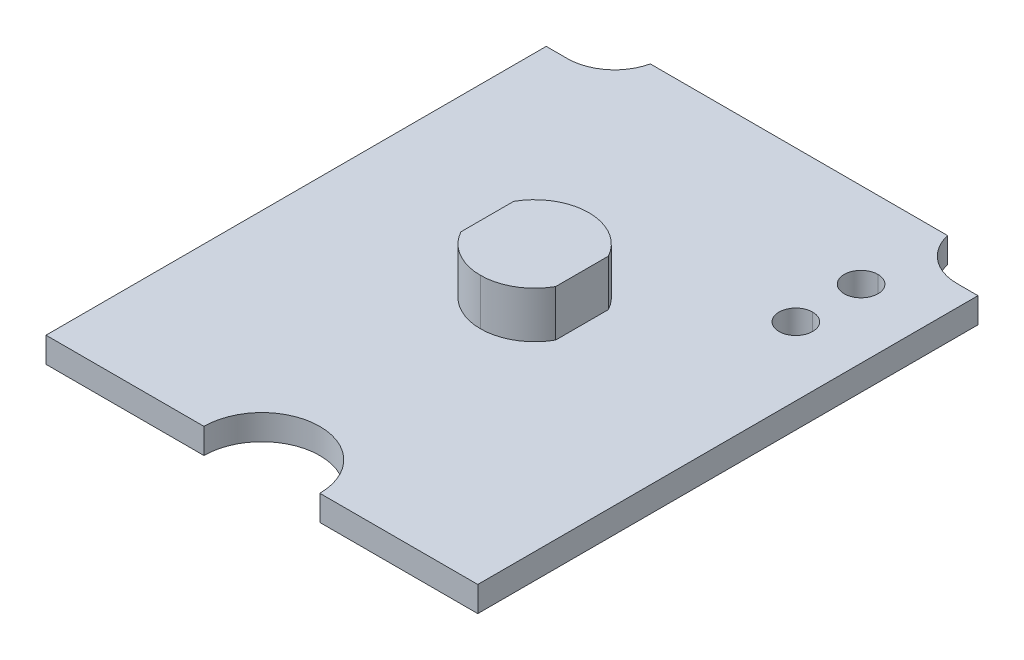
ISO-10303-21;
HEADER;
FILE_DESCRIPTION(('STEP AP214'),'2;1');
FILE_NAME('part.step','',(''),(''),'','','');
FILE_SCHEMA(('AUTOMOTIVE_DESIGN { 1 0 10303 214 1 1 1 1 }'));
ENDSEC;
DATA;
#1=APPLICATION_CONTEXT('core data for automotive mechanical design processes');
#2=APPLICATION_PROTOCOL_DEFINITION('international standard','automotive_design',2000,#1);
#3=PRODUCT_CONTEXT('',#1,'mechanical');
#4=PRODUCT('Part','Part','',(#3));
#5=PRODUCT_RELATED_PRODUCT_CATEGORY('part','',(#4));
#6=PRODUCT_DEFINITION_FORMATION('','',#4);
#7=PRODUCT_DEFINITION_CONTEXT('part definition',#1,'design');
#8=PRODUCT_DEFINITION('design','',#6,#7);
#9=PRODUCT_DEFINITION_SHAPE('','',#8);
#10=(LENGTH_UNIT() NAMED_UNIT(*) SI_UNIT(.MILLI.,.METRE.));
#11=(NAMED_UNIT(*) PLANE_ANGLE_UNIT() SI_UNIT($,.RADIAN.));
#12=(NAMED_UNIT(*) SI_UNIT($,.STERADIAN.) SOLID_ANGLE_UNIT());
#13=UNCERTAINTY_MEASURE_WITH_UNIT(LENGTH_MEASURE(1.E-05),#10,'distance_accuracy_value','');
#14=(GEOMETRIC_REPRESENTATION_CONTEXT(3) GLOBAL_UNCERTAINTY_ASSIGNED_CONTEXT((#13)) GLOBAL_UNIT_ASSIGNED_CONTEXT((#10,
#11,#12)) REPRESENTATION_CONTEXT('',''));
#15=CARTESIAN_POINT('',(0.,0.,0.));
#16=DIRECTION('',(0.,0.,1.));
#17=DIRECTION('',(1.,0.,0.));
#18=AXIS2_PLACEMENT_3D('',#15,#16,#17);
#19=CARTESIAN_POINT('',(0.,2.2,0.));
#20=DIRECTION('',(0.,1.,0.));
#21=DIRECTION('',(1.,0.,0.));
#22=AXIS2_PLACEMENT_3D('',#19,#20,#21);
#23=PLANE('',#22);
#24=DIRECTION('',(0.,0.,1.));
#25=VECTOR('',#24,1.);
#26=CARTESIAN_POINT('',(2.25,2.2,1.252247978637));
#27=LINE('',#26,#25);
#28=CARTESIAN_POINT('',(2.25,2.2,-1.25224797863691));
#29=VERTEX_POINT('',#28);
#30=CARTESIAN_POINT('',(2.25,2.2,1.25224797863691));
#31=VERTEX_POINT('',#30);
#32=EDGE_CURVE('E11',#29,#31,#27,.T.);
#33=ORIENTED_EDGE('',*,*,#32,.F.);
#34=CARTESIAN_POINT('',(0.,2.2,0.));
#35=DIRECTION('',(0.,-1.,0.));
#36=DIRECTION('',(0.,0.,1.));
#37=AXIS2_PLACEMENT_3D('',#34,#35,#36);
#38=CIRCLE('',#37,2.575);
#39=CARTESIAN_POINT('',(-2.25,2.2,-1.25224797863691));
#40=VERTEX_POINT('',#39);
#41=EDGE_CURVE('E422',#40,#29,#38,.T.);
#42=ORIENTED_EDGE('',*,*,#41,.F.);
#43=DIRECTION('',(0.,0.,-1.));
#44=VECTOR('',#43,1.);
#45=CARTESIAN_POINT('',(-2.25,2.2,-1.252247978637));
#46=LINE('',#45,#44);
#47=CARTESIAN_POINT('',(-2.24999999999996,2.2,1.25224797863689));
#48=VERTEX_POINT('',#47);
#49=EDGE_CURVE('E367',#48,#40,#46,.T.);
#50=ORIENTED_EDGE('',*,*,#49,.F.);
#51=CARTESIAN_POINT('',(0.,2.2,0.));
#52=DIRECTION('',(0.,-1.,0.));
#53=DIRECTION('',(0.,0.,1.));
#54=AXIS2_PLACEMENT_3D('',#51,#52,#53);
#55=CIRCLE('',#54,2.575);
#56=CARTESIAN_POINT('',(0.,2.2,2.575));
#57=VERTEX_POINT('',#56);
#58=EDGE_CURVE('E27',#57,#48,#55,.T.);
#59=ORIENTED_EDGE('',*,*,#58,.F.);
#60=CARTESIAN_POINT('',(0.,2.2,0.));
#61=DIRECTION('',(0.,-1.,0.));
#62=DIRECTION('',(0.,0.,1.));
#63=AXIS2_PLACEMENT_3D('',#60,#61,#62);
#64=CIRCLE('',#63,2.575);
#65=EDGE_CURVE('E273',#31,#57,#64,.T.);
#66=ORIENTED_EDGE('',*,*,#65,.F.);
#67=EDGE_LOOP('',(#33,#42,#50,#59,#66));
#68=FACE_BOUND('',#67,.T.);
#69=ADVANCED_FACE('F16',(#68),#23,.T.);
#70=CARTESIAN_POINT('',(2.25,0.,1.252247978637));
#71=DIRECTION('',(1.,0.,0.));
#72=DIRECTION('',(0.,1.,0.));
#73=AXIS2_PLACEMENT_3D('',#70,#71,#72);
#74=PLANE('',#73);
#75=DIRECTION('',(0.,-1.,0.));
#76=VECTOR('',#75,1.);
#77=CARTESIAN_POINT('',(2.25,0.,1.252247978637));
#78=LINE('',#77,#76);
#79=CARTESIAN_POINT('',(2.25,0.,1.25224797863691));
#80=VERTEX_POINT('',#79);
#81=EDGE_CURVE('E269',#31,#80,#78,.T.);
#82=ORIENTED_EDGE('',*,*,#81,.T.);
#83=DIRECTION('',(0.,0.,-1.));
#84=VECTOR('',#83,1.);
#85=CARTESIAN_POINT('',(2.25,0.,0.));
#86=LINE('',#85,#84);
#87=CARTESIAN_POINT('',(2.25,0.,-1.25224797863691));
#88=VERTEX_POINT('',#87);
#89=EDGE_CURVE('E476',#80,#88,#86,.T.);
#90=ORIENTED_EDGE('',*,*,#89,.T.);
#91=DIRECTION('',(0.,1.,0.));
#92=VECTOR('',#91,1.);
#93=CARTESIAN_POINT('',(2.25,0.,-1.252247978637));
#94=LINE('',#93,#92);
#95=EDGE_CURVE('E271',#88,#29,#94,.T.);
#96=ORIENTED_EDGE('',*,*,#95,.T.);
#97=ORIENTED_EDGE('',*,*,#32,.T.);
#98=EDGE_LOOP('',(#82,#90,#96,#97));
#99=FACE_BOUND('',#98,.T.);
#100=ADVANCED_FACE('F266',(#99),#74,.T.);
#101=CARTESIAN_POINT('',(0.,0.,0.));
#102=DIRECTION('',(0.,1.,0.));
#103=DIRECTION('',(0.,0.,1.));
#104=AXIS2_PLACEMENT_3D('',#101,#102,#103);
#105=CYLINDRICAL_SURFACE('',#104,2.575);
#106=CARTESIAN_POINT('',(0.,0.,0.));
#107=DIRECTION('',(0.,1.,0.));
#108=DIRECTION('',(0.,0.,1.));
#109=AXIS2_PLACEMENT_3D('',#106,#107,#108);
#110=CIRCLE('',#109,2.575);
#111=CARTESIAN_POINT('',(-2.24999999999996,0.,1.25224797863689));
#112=VERTEX_POINT('',#111);
#113=CARTESIAN_POINT('',(0.,0.,2.575));
#114=VERTEX_POINT('',#113);
#115=EDGE_CURVE('E314',#112,#114,#110,.T.);
#116=ORIENTED_EDGE('',*,*,#115,.T.);
#117=DIRECTION('',(0.,1.,0.));
#118=VECTOR('',#117,1.);
#119=CARTESIAN_POINT('',(0.,0.,2.575));
#120=LINE('',#119,#118);
#121=EDGE_CURVE('E286',#114,#57,#120,.T.);
#122=ORIENTED_EDGE('',*,*,#121,.T.);
#123=ORIENTED_EDGE('',*,*,#58,.T.);
#124=DIRECTION('',(0.,-1.,0.));
#125=VECTOR('',#124,1.);
#126=CARTESIAN_POINT('',(-2.24999999999992,0.,1.25224797863696));
#127=LINE('',#126,#125);
#128=EDGE_CURVE('E364',#48,#112,#127,.T.);
#129=ORIENTED_EDGE('',*,*,#128,.T.);
#130=EDGE_LOOP('',(#116,#122,#123,#129));
#131=FACE_BOUND('',#130,.T.);
#132=ADVANCED_FACE('F1019',(#131),#105,.T.);
#133=CARTESIAN_POINT('',(0.,0.,0.));
#134=DIRECTION('',(0.,1.,0.));
#135=DIRECTION('',(0.,0.,1.));
#136=AXIS2_PLACEMENT_3D('',#133,#134,#135);
#137=CYLINDRICAL_SURFACE('',#136,2.575);
#138=ORIENTED_EDGE('',*,*,#95,.F.);
#139=CARTESIAN_POINT('',(0.,0.,0.));
#140=DIRECTION('',(0.,1.,0.));
#141=DIRECTION('',(0.,0.,1.));
#142=AXIS2_PLACEMENT_3D('',#139,#140,#141);
#143=CIRCLE('',#142,2.575);
#144=CARTESIAN_POINT('',(-2.25,0.,-1.25224797863691));
#145=VERTEX_POINT('',#144);
#146=EDGE_CURVE('E313',#88,#145,#143,.T.);
#147=ORIENTED_EDGE('',*,*,#146,.T.);
#148=DIRECTION('',(0.,-1.,0.));
#149=VECTOR('',#148,1.);
#150=CARTESIAN_POINT('',(-2.25,0.,-1.252247978637));
#151=LINE('',#150,#149);
#152=EDGE_CURVE('E279',#40,#145,#151,.T.);
#153=ORIENTED_EDGE('',*,*,#152,.F.);
#154=ORIENTED_EDGE('',*,*,#41,.T.);
#155=EDGE_LOOP('',(#138,#147,#153,#154));
#156=FACE_BOUND('',#155,.T.);
#157=ADVANCED_FACE('F1014',(#156),#137,.T.);
#158=CARTESIAN_POINT('',(-2.25,0.,-1.252247978637));
#159=DIRECTION('',(-1.,0.,0.));
#160=DIRECTION('',(0.,0.,1.));
#161=AXIS2_PLACEMENT_3D('',#158,#159,#160);
#162=PLANE('',#161);
#163=ORIENTED_EDGE('',*,*,#152,.T.);
#164=DIRECTION('',(0.,0.,1.));
#165=VECTOR('',#164,1.);
#166=CARTESIAN_POINT('',(-2.25,0.,0.));
#167=LINE('',#166,#165);
#168=EDGE_CURVE('E309',#145,#112,#167,.T.);
#169=ORIENTED_EDGE('',*,*,#168,.T.);
#170=ORIENTED_EDGE('',*,*,#128,.F.);
#171=ORIENTED_EDGE('',*,*,#49,.T.);
#172=EDGE_LOOP('',(#163,#169,#170,#171));
#173=FACE_BOUND('',#172,.T.);
#174=ADVANCED_FACE('F1018',(#173),#162,.T.);
#175=CARTESIAN_POINT('',(0.,0.,0.));
#176=DIRECTION('',(0.,1.,0.));
#177=DIRECTION('',(0.,0.,1.));
#178=AXIS2_PLACEMENT_3D('',#175,#176,#177);
#179=CYLINDRICAL_SURFACE('',#178,2.575);
#180=ORIENTED_EDGE('',*,*,#121,.F.);
#181=CARTESIAN_POINT('',(0.,0.,0.));
#182=DIRECTION('',(0.,1.,0.));
#183=DIRECTION('',(0.,0.,1.));
#184=AXIS2_PLACEMENT_3D('',#181,#182,#183);
#185=CIRCLE('',#184,2.575);
#186=EDGE_CURVE('E283',#114,#80,#185,.T.);
#187=ORIENTED_EDGE('',*,*,#186,.T.);
#188=ORIENTED_EDGE('',*,*,#81,.F.);
#189=ORIENTED_EDGE('',*,*,#65,.T.);
#190=EDGE_LOOP('',(#180,#187,#188,#189));
#191=FACE_BOUND('',#190,.T.);
#192=ADVANCED_FACE('F281',(#191),#179,.T.);
#193=CARTESIAN_POINT('',(0.,0.,0.));
#194=DIRECTION('',(0.,1.,0.));
#195=DIRECTION('',(1.,0.,0.));
#196=AXIS2_PLACEMENT_3D('',#193,#194,#195);
#197=PLANE('',#196);
#198=CARTESIAN_POINT('',(0.,0.,-1.75));
#199=DIRECTION('',(0.,-1.,0.));
#200=DIRECTION('',(0.,0.,1.));
#201=AXIS2_PLACEMENT_3D('',#198,#199,#200);
#202=CIRCLE('',#201,0.25);
#203=CARTESIAN_POINT('',(0.,0.,-1.5));
#204=VERTEX_POINT('',#203);
#205=CARTESIAN_POINT('',(0.,0.,-2.));
#206=VERTEX_POINT('',#205);
#207=EDGE_CURVE('E374',#204,#206,#202,.T.);
#208=ORIENTED_EDGE('',*,*,#207,.F.);
#209=CARTESIAN_POINT('',(0.,0.,-1.75));
#210=DIRECTION('',(0.,-1.,0.));
#211=DIRECTION('',(0.,0.,1.));
#212=AXIS2_PLACEMENT_3D('',#209,#210,#211);
#213=CIRCLE('',#212,0.25);
#214=EDGE_CURVE('E308',#206,#204,#213,.T.);
#215=ORIENTED_EDGE('',*,*,#214,.F.);
#216=EDGE_LOOP('',(#208,#215));
#217=FACE_BOUND('',#216,.T.);
#218=CARTESIAN_POINT('',(0.,0.,1.75));
#219=DIRECTION('',(0.,-1.,0.));
#220=DIRECTION('',(0.,0.,1.));
#221=AXIS2_PLACEMENT_3D('',#218,#219,#220);
#222=CIRCLE('',#221,0.25);
#223=CARTESIAN_POINT('',(0.,0.,2.));
#224=VERTEX_POINT('',#223);
#225=CARTESIAN_POINT('',(0.,0.,1.5));
#226=VERTEX_POINT('',#225);
#227=EDGE_CURVE('E377',#224,#226,#222,.T.);
#228=ORIENTED_EDGE('',*,*,#227,.F.);
#229=CARTESIAN_POINT('',(0.,0.,1.75));
#230=DIRECTION('',(0.,-1.,0.));
#231=DIRECTION('',(0.,0.,1.));
#232=AXIS2_PLACEMENT_3D('',#229,#230,#231);
#233=CIRCLE('',#232,0.25);
#234=EDGE_CURVE('E472',#226,#224,#233,.T.);
#235=ORIENTED_EDGE('',*,*,#234,.F.);
#236=EDGE_LOOP('',(#228,#235));
#237=FACE_BOUND('',#236,.T.);
#238=ORIENTED_EDGE('',*,*,#115,.F.);
#239=ORIENTED_EDGE('',*,*,#168,.F.);
#240=ORIENTED_EDGE('',*,*,#146,.F.);
#241=ORIENTED_EDGE('',*,*,#89,.F.);
#242=ORIENTED_EDGE('',*,*,#186,.F.);
#243=EDGE_LOOP('',(#238,#239,#240,#241,#242));
#244=FACE_BOUND('',#243,.T.);
#245=ADVANCED_FACE('F1195',(#217,#237,#244),#197,.F.);
#246=CARTESIAN_POINT('',(0.,-4.5,0.));
#247=DIRECTION('',(0.,1.,0.));
#248=DIRECTION('',(1.,0.,0.));
#249=AXIS2_PLACEMENT_3D('',#246,#247,#248);
#250=PLANE('',#249);
#251=CARTESIAN_POINT('',(0.,-4.5,-1.75));
#252=DIRECTION('',(0.,1.,0.));
#253=DIRECTION('',(0.,0.,1.));
#254=AXIS2_PLACEMENT_3D('',#251,#252,#253);
#255=CIRCLE('',#254,0.25);
#256=CARTESIAN_POINT('',(0.,-4.5,-1.5));
#257=VERTEX_POINT('',#256);
#258=CARTESIAN_POINT('',(0.,-4.5,-2.));
#259=VERTEX_POINT('',#258);
#260=EDGE_CURVE('E20',#257,#259,#255,.T.);
#261=ORIENTED_EDGE('',*,*,#260,.F.);
#262=CARTESIAN_POINT('',(0.,-4.5,-1.75));
#263=DIRECTION('',(0.,1.,0.));
#264=DIRECTION('',(0.,0.,1.));
#265=AXIS2_PLACEMENT_3D('',#262,#263,#264);
#266=CIRCLE('',#265,0.25);
#267=EDGE_CURVE('E412',#259,#257,#266,.T.);
#268=ORIENTED_EDGE('',*,*,#267,.F.);
#269=EDGE_LOOP('',(#261,#268));
#270=FACE_BOUND('',#269,.T.);
#271=ADVANCED_FACE('F1186',(#270),#250,.F.);
#272=CARTESIAN_POINT('',(0.,-3.2,0.));
#273=DIRECTION('',(0.,-1.,0.));
#274=DIRECTION('',(0.,0.,-1.));
#275=AXIS2_PLACEMENT_3D('',#272,#273,#274);
#276=PLANE('',#275);
#277=DIRECTION('',(-1.,0.,0.));
#278=VECTOR('',#277,1.);
#279=CARTESIAN_POINT('',(-9.,-3.2,-3.2));
#280=LINE('',#279,#278);
#281=CARTESIAN_POINT('',(-3.,-3.2,-3.2));
#282=VERTEX_POINT('',#281);
#283=CARTESIAN_POINT('',(-9.,-3.2,-3.2));
#284=VERTEX_POINT('',#283);
#285=EDGE_CURVE('E406',#282,#284,#280,.T.);
#286=ORIENTED_EDGE('',*,*,#285,.F.);
#287=DIRECTION('',(0.,0.,-1.));
#288=VECTOR('',#287,1.);
#289=CARTESIAN_POINT('',(-3.,-3.2,-3.2));
#290=LINE('',#289,#288);
#291=CARTESIAN_POINT('',(-3.,-3.2,5.5));
#292=VERTEX_POINT('',#291);
#293=EDGE_CURVE('E402',#292,#282,#290,.T.);
#294=ORIENTED_EDGE('',*,*,#293,.F.);
#295=DIRECTION('',(1.,0.,0.));
#296=VECTOR('',#295,1.);
#297=CARTESIAN_POINT('',(-3.,-3.2,5.5));
#298=LINE('',#297,#296);
#299=CARTESIAN_POINT('',(-9.,-3.2,5.5));
#300=VERTEX_POINT('',#299);
#301=EDGE_CURVE('E454',#300,#292,#298,.T.);
#302=ORIENTED_EDGE('',*,*,#301,.F.);
#303=DIRECTION('',(0.,0.,1.));
#304=VECTOR('',#303,1.);
#305=CARTESIAN_POINT('',(-9.,-3.2,5.5));
#306=LINE('',#305,#304);
#307=EDGE_CURVE('E378',#284,#300,#306,.T.);
#308=ORIENTED_EDGE('',*,*,#307,.F.);
#309=EDGE_LOOP('',(#286,#294,#302,#308));
#310=FACE_BOUND('',#309,.T.);
#311=ADVANCED_FACE('F1000',(#310),#276,.T.);
#312=CARTESIAN_POINT('',(0.,-4.5,0.));
#313=DIRECTION('',(0.,1.,0.));
#314=DIRECTION('',(1.,0.,0.));
#315=AXIS2_PLACEMENT_3D('',#312,#313,#314);
#316=PLANE('',#315);
#317=CARTESIAN_POINT('',(0.,-4.5,1.75));
#318=DIRECTION('',(0.,1.,0.));
#319=DIRECTION('',(0.,0.,1.));
#320=AXIS2_PLACEMENT_3D('',#317,#318,#319);
#321=CIRCLE('',#320,0.25);
#322=CARTESIAN_POINT('',(0.,-4.5,2.));
#323=VERTEX_POINT('',#322);
#324=CARTESIAN_POINT('',(0.,-4.5,1.5));
#325=VERTEX_POINT('',#324);
#326=EDGE_CURVE('E484',#323,#325,#321,.T.);
#327=ORIENTED_EDGE('',*,*,#326,.F.);
#328=CARTESIAN_POINT('',(0.,-4.5,1.75));
#329=DIRECTION('',(0.,1.,0.));
#330=DIRECTION('',(0.,0.,1.));
#331=AXIS2_PLACEMENT_3D('',#328,#329,#330);
#332=CIRCLE('',#331,0.25);
#333=EDGE_CURVE('E480',#325,#323,#332,.T.);
#334=ORIENTED_EDGE('',*,*,#333,.F.);
#335=EDGE_LOOP('',(#327,#334));
#336=FACE_BOUND('',#335,.T.);
#337=ADVANCED_FACE('F995',(#336),#316,.F.);
#338=CARTESIAN_POINT('',(0.,0.,-1.75));
#339=DIRECTION('',(0.,1.,0.));
#340=DIRECTION('',(0.,0.,1.));
#341=AXIS2_PLACEMENT_3D('',#338,#339,#340);
#342=CYLINDRICAL_SURFACE('',#341,0.25);
#343=DIRECTION('',(0.,1.,0.));
#344=VECTOR('',#343,1.);
#345=CARTESIAN_POINT('',(0.,0.,-2.));
#346=LINE('',#345,#344);
#347=CARTESIAN_POINT('',(0.,-0.2,-2.));
#348=VERTEX_POINT('',#347);
#349=EDGE_CURVE('E463',#348,#206,#346,.T.);
#350=ORIENTED_EDGE('',*,*,#349,.F.);
#351=CARTESIAN_POINT('',(0.,-0.2,-1.75));
#352=DIRECTION('',(0.,1.,0.));
#353=DIRECTION('',(0.,0.,1.));
#354=AXIS2_PLACEMENT_3D('',#351,#352,#353);
#355=CIRCLE('',#354,0.25);
#356=CARTESIAN_POINT('',(0.,-0.2,-1.5));
#357=VERTEX_POINT('',#356);
#358=EDGE_CURVE('E346',#348,#357,#355,.T.);
#359=ORIENTED_EDGE('',*,*,#358,.T.);
#360=DIRECTION('',(0.,1.,0.));
#361=VECTOR('',#360,1.);
#362=CARTESIAN_POINT('',(0.,0.,-1.5));
#363=LINE('',#362,#361);
#364=EDGE_CURVE('E303',#357,#204,#363,.T.);
#365=ORIENTED_EDGE('',*,*,#364,.T.);
#366=ORIENTED_EDGE('',*,*,#207,.T.);
#367=EDGE_LOOP('',(#350,#359,#365,#366));
#368=FACE_BOUND('',#367,.T.);
#369=ADVANCED_FACE('F999',(#368),#342,.T.);
#370=CARTESIAN_POINT('',(0.,0.,1.75));
#371=DIRECTION('',(0.,1.,0.));
#372=DIRECTION('',(0.,0.,1.));
#373=AXIS2_PLACEMENT_3D('',#370,#371,#372);
#374=CYLINDRICAL_SURFACE('',#373,0.25);
#375=DIRECTION('',(0.,1.,0.));
#376=VECTOR('',#375,1.);
#377=CARTESIAN_POINT('',(0.,0.,1.5));
#378=LINE('',#377,#376);
#379=CARTESIAN_POINT('',(0.,-0.2,1.5));
#380=VERTEX_POINT('',#379);
#381=EDGE_CURVE('E307',#380,#226,#378,.T.);
#382=ORIENTED_EDGE('',*,*,#381,.F.);
#383=CARTESIAN_POINT('',(0.,-0.2,1.75));
#384=DIRECTION('',(0.,1.,0.));
#385=DIRECTION('',(0.,0.,1.));
#386=AXIS2_PLACEMENT_3D('',#383,#384,#385);
#387=CIRCLE('',#386,0.25);
#388=CARTESIAN_POINT('',(0.,-0.2,2.));
#389=VERTEX_POINT('',#388);
#390=EDGE_CURVE('E485',#380,#389,#387,.T.);
#391=ORIENTED_EDGE('',*,*,#390,.T.);
#392=DIRECTION('',(0.,1.,0.));
#393=VECTOR('',#392,1.);
#394=CARTESIAN_POINT('',(0.,0.,2.));
#395=LINE('',#394,#393);
#396=EDGE_CURVE('E517',#389,#224,#395,.T.);
#397=ORIENTED_EDGE('',*,*,#396,.T.);
#398=ORIENTED_EDGE('',*,*,#227,.T.);
#399=EDGE_LOOP('',(#382,#391,#397,#398));
#400=FACE_BOUND('',#399,.T.);
#401=ADVANCED_FACE('F989',(#400),#374,.T.);
#402=CARTESIAN_POINT('',(0.,0.,1.75));
#403=DIRECTION('',(0.,1.,0.));
#404=DIRECTION('',(0.,0.,1.));
#405=AXIS2_PLACEMENT_3D('',#402,#403,#404);
#406=CYLINDRICAL_SURFACE('',#405,0.25);
#407=CARTESIAN_POINT('',(0.,-0.2,1.75));
#408=DIRECTION('',(0.,1.,0.));
#409=DIRECTION('',(0.,0.,1.));
#410=AXIS2_PLACEMENT_3D('',#407,#408,#409);
#411=CIRCLE('',#410,0.25);
#412=EDGE_CURVE('E433',#389,#380,#411,.T.);
#413=ORIENTED_EDGE('',*,*,#412,.T.);
#414=ORIENTED_EDGE('',*,*,#381,.T.);
#415=ORIENTED_EDGE('',*,*,#234,.T.);
#416=ORIENTED_EDGE('',*,*,#396,.F.);
#417=EDGE_LOOP('',(#413,#414,#415,#416));
#418=FACE_BOUND('',#417,.T.);
#419=ADVANCED_FACE('F969',(#418),#406,.T.);
#420=CARTESIAN_POINT('',(0.,0.,-1.75));
#421=DIRECTION('',(0.,1.,0.));
#422=DIRECTION('',(0.,0.,1.));
#423=AXIS2_PLACEMENT_3D('',#420,#421,#422);
#424=CYLINDRICAL_SURFACE('',#423,0.25);
#425=CARTESIAN_POINT('',(0.,-0.2,-1.75));
#426=DIRECTION('',(0.,1.,0.));
#427=DIRECTION('',(0.,0.,1.));
#428=AXIS2_PLACEMENT_3D('',#425,#426,#427);
#429=CIRCLE('',#428,0.25);
#430=EDGE_CURVE('E351',#357,#348,#429,.T.);
#431=ORIENTED_EDGE('',*,*,#430,.T.);
#432=ORIENTED_EDGE('',*,*,#349,.T.);
#433=ORIENTED_EDGE('',*,*,#214,.T.);
#434=ORIENTED_EDGE('',*,*,#364,.F.);
#435=EDGE_LOOP('',(#431,#432,#433,#434));
#436=FACE_BOUND('',#435,.T.);
#437=ADVANCED_FACE('F960',(#436),#424,.T.);
#438=CARTESIAN_POINT('',(7.,-0.2,-8.5));
#439=DIRECTION('',(0.,1.,0.));
#440=DIRECTION('',(0.,0.,1.));
#441=AXIS2_PLACEMENT_3D('',#438,#439,#440);
#442=CYLINDRICAL_SURFACE('',#441,0.8);
#443=DIRECTION('',(0.,1.,0.));
#444=VECTOR('',#443,1.);
#445=CARTESIAN_POINT('',(7.,-0.2,-9.3));
#446=LINE('',#445,#444);
#447=CARTESIAN_POINT('',(7.,-1.4,-9.3));
#448=VERTEX_POINT('',#447);
#449=CARTESIAN_POINT('',(7.,-0.2,-9.3));
#450=VERTEX_POINT('',#449);
#451=EDGE_CURVE('E544',#448,#450,#446,.T.);
#452=ORIENTED_EDGE('',*,*,#451,.F.);
#453=CARTESIAN_POINT('',(7.,-1.4,-8.5));
#454=DIRECTION('',(0.,1.,0.));
#455=DIRECTION('',(0.,0.,1.));
#456=AXIS2_PLACEMENT_3D('',#453,#454,#455);
#457=CIRCLE('',#456,0.8);
#458=CARTESIAN_POINT('',(7.,-1.4,-7.7));
#459=VERTEX_POINT('',#458);
#460=EDGE_CURVE('E492',#459,#448,#457,.T.);
#461=ORIENTED_EDGE('',*,*,#460,.F.);
#462=DIRECTION('',(0.,1.,0.));
#463=VECTOR('',#462,1.);
#464=CARTESIAN_POINT('',(7.,-0.2,-7.7));
#465=LINE('',#464,#463);
#466=CARTESIAN_POINT('',(7.,-0.2,-7.7));
#467=VERTEX_POINT('',#466);
#468=EDGE_CURVE('E511',#459,#467,#465,.T.);
#469=ORIENTED_EDGE('',*,*,#468,.T.);
#470=CARTESIAN_POINT('',(7.,-0.2,-8.5));
#471=DIRECTION('',(0.,1.,0.));
#472=DIRECTION('',(0.,0.,1.));
#473=AXIS2_PLACEMENT_3D('',#470,#471,#472);
#474=CIRCLE('',#473,0.8);
#475=EDGE_CURVE('E358',#467,#450,#474,.T.);
#476=ORIENTED_EDGE('',*,*,#475,.T.);
#477=EDGE_LOOP('',(#452,#461,#469,#476));
#478=FACE_BOUND('',#477,.T.);
#479=ADVANCED_FACE('F955',(#478),#442,.F.);
#480=CARTESIAN_POINT('',(0.,-0.2,12.95));
#481=DIRECTION('',(0.,1.,0.));
#482=DIRECTION('',(0.,0.,1.));
#483=AXIS2_PLACEMENT_3D('',#480,#481,#482);
#484=CYLINDRICAL_SURFACE('',#483,2.75);
#485=CARTESIAN_POINT('',(0.,-0.2,12.95));
#486=DIRECTION('',(0.,1.,0.));
#487=DIRECTION('',(0.,0.,1.));
#488=AXIS2_PLACEMENT_3D('',#485,#486,#487);
#489=CIRCLE('',#488,2.75);
#490=CARTESIAN_POINT('',(2.75,-0.2,12.95));
#491=VERTEX_POINT('',#490);
#492=CARTESIAN_POINT('',(-2.75,-0.2,12.95));
#493=VERTEX_POINT('',#492);
#494=EDGE_CURVE('E368',#491,#493,#489,.T.);
#495=ORIENTED_EDGE('',*,*,#494,.T.);
#496=DIRECTION('',(0.,1.,0.));
#497=VECTOR('',#496,1.);
#498=CARTESIAN_POINT('',(-2.75,-0.2,12.95));
#499=LINE('',#498,#497);
#500=CARTESIAN_POINT('',(-2.75,-1.4,12.95));
#501=VERTEX_POINT('',#500);
#502=EDGE_CURVE('E411',#501,#493,#499,.T.);
#503=ORIENTED_EDGE('',*,*,#502,.F.);
#504=CARTESIAN_POINT('',(0.,-1.4,12.95));
#505=DIRECTION('',(0.,1.,0.));
#506=DIRECTION('',(0.,0.,1.));
#507=AXIS2_PLACEMENT_3D('',#504,#505,#506);
#508=CIRCLE('',#507,2.75);
#509=CARTESIAN_POINT('',(2.75,-1.4,12.95));
#510=VERTEX_POINT('',#509);
#511=EDGE_CURVE('E315',#510,#501,#508,.T.);
#512=ORIENTED_EDGE('',*,*,#511,.F.);
#513=DIRECTION('',(0.,-1.,0.));
#514=VECTOR('',#513,1.);
#515=CARTESIAN_POINT('',(2.75,-0.2,12.95));
#516=LINE('',#515,#514);
#517=EDGE_CURVE('E499',#491,#510,#516,.T.);
#518=ORIENTED_EDGE('',*,*,#517,.F.);
#519=EDGE_LOOP('',(#495,#503,#512,#518));
#520=FACE_BOUND('',#519,.T.);
#521=ADVANCED_FACE('F959',(#520),#484,.F.);
#522=CARTESIAN_POINT('',(7.,-0.2,-5.4));
#523=DIRECTION('',(0.,1.,0.));
#524=DIRECTION('',(0.,0.,1.));
#525=AXIS2_PLACEMENT_3D('',#522,#523,#524);
#526=CYLINDRICAL_SURFACE('',#525,0.8);
#527=DIRECTION('',(0.,1.,0.));
#528=VECTOR('',#527,1.);
#529=CARTESIAN_POINT('',(7.,-0.2,-6.2));
#530=LINE('',#529,#528);
#531=CARTESIAN_POINT('',(7.,-1.4,-6.2));
#532=VERTEX_POINT('',#531);
#533=CARTESIAN_POINT('',(7.,-0.2,-6.2));
#534=VERTEX_POINT('',#533);
#535=EDGE_CURVE('E296',#532,#534,#530,.T.);
#536=ORIENTED_EDGE('',*,*,#535,.F.);
#537=CARTESIAN_POINT('',(7.,-1.4,-5.4));
#538=DIRECTION('',(0.,1.,0.));
#539=DIRECTION('',(0.,0.,1.));
#540=AXIS2_PLACEMENT_3D('',#537,#538,#539);
#541=CIRCLE('',#540,0.8);
#542=CARTESIAN_POINT('',(7.,-1.4,-4.6));
#543=VERTEX_POINT('',#542);
#544=EDGE_CURVE('E344',#543,#532,#541,.T.);
#545=ORIENTED_EDGE('',*,*,#544,.F.);
#546=DIRECTION('',(0.,1.,0.));
#547=VECTOR('',#546,1.);
#548=CARTESIAN_POINT('',(7.,-0.2,-4.6));
#549=LINE('',#548,#547);
#550=CARTESIAN_POINT('',(7.,-0.2,-4.6));
#551=VERTEX_POINT('',#550);
#552=EDGE_CURVE('E533',#543,#551,#549,.T.);
#553=ORIENTED_EDGE('',*,*,#552,.T.);
#554=CARTESIAN_POINT('',(7.,-0.2,-5.4));
#555=DIRECTION('',(0.,1.,0.));
#556=DIRECTION('',(0.,0.,1.));
#557=AXIS2_PLACEMENT_3D('',#554,#555,#556);
#558=CIRCLE('',#557,0.8);
#559=EDGE_CURVE('E401',#551,#534,#558,.T.);
#560=ORIENTED_EDGE('',*,*,#559,.T.);
#561=EDGE_LOOP('',(#536,#545,#553,#560));
#562=FACE_BOUND('',#561,.T.);
#563=ADVANCED_FACE('F1025',(#562),#526,.F.);
#564=CARTESIAN_POINT('',(0.,0.,1.75));
#565=DIRECTION('',(0.,1.,0.));
#566=DIRECTION('',(0.,0.,1.));
#567=AXIS2_PLACEMENT_3D('',#564,#565,#566);
#568=CYLINDRICAL_SURFACE('',#567,0.25);
#569=DIRECTION('',(0.,1.,0.));
#570=VECTOR('',#569,1.);
#571=CARTESIAN_POINT('',(0.,0.,1.5));
#572=LINE('',#571,#570);
#573=CARTESIAN_POINT('',(0.,-1.4,1.5));
#574=VERTEX_POINT('',#573);
#575=EDGE_CURVE('E481',#325,#574,#572,.T.);
#576=ORIENTED_EDGE('',*,*,#575,.F.);
#577=ORIENTED_EDGE('',*,*,#333,.T.);
#578=DIRECTION('',(0.,1.,0.));
#579=VECTOR('',#578,1.);
#580=CARTESIAN_POINT('',(0.,0.,2.));
#581=LINE('',#580,#579);
#582=CARTESIAN_POINT('',(0.,-1.4,2.));
#583=VERTEX_POINT('',#582);
#584=EDGE_CURVE('E459',#323,#583,#581,.T.);
#585=ORIENTED_EDGE('',*,*,#584,.T.);
#586=CARTESIAN_POINT('',(0.,-1.4,1.75));
#587=DIRECTION('',(0.,1.,0.));
#588=DIRECTION('',(0.,0.,1.));
#589=AXIS2_PLACEMENT_3D('',#586,#587,#588);
#590=CIRCLE('',#589,0.25);
#591=EDGE_CURVE('E512',#574,#583,#590,.T.);
#592=ORIENTED_EDGE('',*,*,#591,.F.);
#593=EDGE_LOOP('',(#576,#577,#585,#592));
#594=FACE_BOUND('',#593,.T.);
#595=ADVANCED_FACE('F934',(#594),#568,.T.);
#596=CARTESIAN_POINT('',(0.,0.,-1.75));
#597=DIRECTION('',(0.,1.,0.));
#598=DIRECTION('',(0.,0.,1.));
#599=AXIS2_PLACEMENT_3D('',#596,#597,#598);
#600=CYLINDRICAL_SURFACE('',#599,0.25);
#601=ORIENTED_EDGE('',*,*,#260,.T.);
#602=DIRECTION('',(0.,1.,0.));
#603=VECTOR('',#602,1.);
#604=CARTESIAN_POINT('',(0.,0.,-2.));
#605=LINE('',#604,#603);
#606=CARTESIAN_POINT('',(0.,-1.4,-2.));
#607=VERTEX_POINT('',#606);
#608=EDGE_CURVE('E441',#259,#607,#605,.T.);
#609=ORIENTED_EDGE('',*,*,#608,.T.);
#610=CARTESIAN_POINT('',(0.,-1.4,-1.75));
#611=DIRECTION('',(0.,1.,0.));
#612=DIRECTION('',(0.,0.,1.));
#613=AXIS2_PLACEMENT_3D('',#610,#611,#612);
#614=CIRCLE('',#613,0.25);
#615=CARTESIAN_POINT('',(0.,-1.4,-1.5));
#616=VERTEX_POINT('',#615);
#617=EDGE_CURVE('E446',#616,#607,#614,.T.);
#618=ORIENTED_EDGE('',*,*,#617,.F.);
#619=DIRECTION('',(0.,1.,0.));
#620=VECTOR('',#619,1.);
#621=CARTESIAN_POINT('',(0.,0.,-1.5));
#622=LINE('',#621,#620);
#623=EDGE_CURVE('E408',#257,#616,#622,.T.);
#624=ORIENTED_EDGE('',*,*,#623,.F.);
#625=EDGE_LOOP('',(#601,#609,#618,#624));
#626=FACE_BOUND('',#625,.T.);
#627=ADVANCED_FACE('F929',(#626),#600,.T.);
#628=CARTESIAN_POINT('',(10.25,-0.2,12.95));
#629=DIRECTION('',(0.,0.,1.));
#630=DIRECTION('',(1.,0.,0.));
#631=AXIS2_PLACEMENT_3D('',#628,#629,#630);
#632=PLANE('',#631);
#633=ORIENTED_EDGE('',*,*,#502,.T.);
#634=DIRECTION('',(-1.,0.,0.));
#635=VECTOR('',#634,1.);
#636=CARTESIAN_POINT('',(0.,-0.2,12.95));
#637=LINE('',#636,#635);
#638=CARTESIAN_POINT('',(-10.25,-0.2,12.95));
#639=VERTEX_POINT('',#638);
#640=EDGE_CURVE('E373',#493,#639,#637,.T.);
#641=ORIENTED_EDGE('',*,*,#640,.T.);
#642=DIRECTION('',(0.,1.,0.));
#643=VECTOR('',#642,1.);
#644=CARTESIAN_POINT('',(-10.25,-0.2,12.95));
#645=LINE('',#644,#643);
#646=CARTESIAN_POINT('',(-10.25,-1.4,12.95));
#647=VERTEX_POINT('',#646);
#648=EDGE_CURVE('E384',#647,#639,#645,.T.);
#649=ORIENTED_EDGE('',*,*,#648,.F.);
#650=DIRECTION('',(1.,0.,0.));
#651=VECTOR('',#650,1.);
#652=CARTESIAN_POINT('',(10.25,-1.4,12.95));
#653=LINE('',#652,#651);
#654=EDGE_CURVE('E319',#647,#501,#653,.T.);
#655=ORIENTED_EDGE('',*,*,#654,.T.);
#656=EDGE_LOOP('',(#633,#641,#649,#655));
#657=FACE_BOUND('',#656,.T.);
#658=ADVANCED_FACE('F933',(#657),#632,.T.);
#659=CARTESIAN_POINT('',(10.25,-0.2,-12.55));
#660=DIRECTION('',(1.,0.,0.));
#661=DIRECTION('',(0.,1.,0.));
#662=AXIS2_PLACEMENT_3D('',#659,#660,#661);
#663=PLANE('',#662);
#664=DIRECTION('',(0.,0.,-1.));
#665=VECTOR('',#664,1.);
#666=CARTESIAN_POINT('',(10.25,-1.4,-12.55));
#667=LINE('',#666,#665);
#668=CARTESIAN_POINT('',(10.25,-1.4,12.95));
#669=VERTEX_POINT('',#668);
#670=CARTESIAN_POINT('',(10.25,-1.4,-10.8));
#671=VERTEX_POINT('',#670);
#672=EDGE_CURVE('E330',#669,#671,#667,.T.);
#673=ORIENTED_EDGE('',*,*,#672,.T.);
#674=DIRECTION('',(0.,1.,0.));
#675=VECTOR('',#674,1.);
#676=CARTESIAN_POINT('',(10.25,-0.2,-10.8));
#677=LINE('',#676,#675);
#678=CARTESIAN_POINT('',(10.25,-0.2,-10.8));
#679=VERTEX_POINT('',#678);
#680=EDGE_CURVE('E547',#671,#679,#677,.T.);
#681=ORIENTED_EDGE('',*,*,#680,.T.);
#682=DIRECTION('',(0.,0.,1.));
#683=VECTOR('',#682,1.);
#684=CARTESIAN_POINT('',(10.25,-0.2,0.));
#685=LINE('',#684,#683);
#686=CARTESIAN_POINT('',(10.25,-0.2,12.95));
#687=VERTEX_POINT('',#686);
#688=EDGE_CURVE('E325',#679,#687,#685,.T.);
#689=ORIENTED_EDGE('',*,*,#688,.T.);
#690=DIRECTION('',(0.,1.,0.));
#691=VECTOR('',#690,1.);
#692=CARTESIAN_POINT('',(10.25,-0.2,12.95));
#693=LINE('',#692,#691);
#694=EDGE_CURVE('E539',#669,#687,#693,.T.);
#695=ORIENTED_EDGE('',*,*,#694,.F.);
#696=EDGE_LOOP('',(#673,#681,#689,#695));
#697=FACE_BOUND('',#696,.T.);
#698=ADVANCED_FACE('F628',(#697),#663,.T.);
#699=CARTESIAN_POINT('',(0.,0.,-1.75));
#700=DIRECTION('',(0.,1.,0.));
#701=DIRECTION('',(0.,0.,1.));
#702=AXIS2_PLACEMENT_3D('',#699,#700,#701);
#703=CYLINDRICAL_SURFACE('',#702,0.25);
#704=ORIENTED_EDGE('',*,*,#608,.F.);
#705=ORIENTED_EDGE('',*,*,#267,.T.);
#706=ORIENTED_EDGE('',*,*,#623,.T.);
#707=CARTESIAN_POINT('',(0.,-1.4,-1.75));
#708=DIRECTION('',(0.,1.,0.));
#709=DIRECTION('',(0.,0.,1.));
#710=AXIS2_PLACEMENT_3D('',#707,#708,#709);
#711=CIRCLE('',#710,0.25);
#712=EDGE_CURVE('E442',#607,#616,#711,.T.);
#713=ORIENTED_EDGE('',*,*,#712,.F.);
#714=EDGE_LOOP('',(#704,#705,#706,#713));
#715=FACE_BOUND('',#714,.T.);
#716=ADVANCED_FACE('F1062',(#715),#703,.T.);
#717=CARTESIAN_POINT('',(10.25,-0.2,12.95));
#718=DIRECTION('',(0.,0.,1.));
#719=DIRECTION('',(1.,0.,0.));
#720=AXIS2_PLACEMENT_3D('',#717,#718,#719);
#721=PLANE('',#720);
#722=ORIENTED_EDGE('',*,*,#694,.T.);
#723=DIRECTION('',(-1.,0.,0.));
#724=VECTOR('',#723,1.);
#725=CARTESIAN_POINT('',(0.,-0.2,12.95));
#726=LINE('',#725,#724);
#727=EDGE_CURVE('E372',#687,#491,#726,.T.);
#728=ORIENTED_EDGE('',*,*,#727,.T.);
#729=ORIENTED_EDGE('',*,*,#517,.T.);
#730=DIRECTION('',(1.,0.,0.));
#731=VECTOR('',#730,1.);
#732=CARTESIAN_POINT('',(10.25,-1.4,12.95));
#733=LINE('',#732,#731);
#734=EDGE_CURVE('E320',#510,#669,#733,.T.);
#735=ORIENTED_EDGE('',*,*,#734,.T.);
#736=EDGE_LOOP('',(#722,#728,#729,#735));
#737=FACE_BOUND('',#736,.T.);
#738=ADVANCED_FACE('F1066',(#737),#721,.T.);
#739=CARTESIAN_POINT('',(-3.,-1.4,5.5));
#740=DIRECTION('',(0.,0.,1.));
#741=DIRECTION('',(1.,0.,0.));
#742=AXIS2_PLACEMENT_3D('',#739,#740,#741);
#743=PLANE('',#742);
#744=DIRECTION('',(0.,-1.,0.));
#745=VECTOR('',#744,1.);
#746=CARTESIAN_POINT('',(-3.,-1.4,5.5));
#747=LINE('',#746,#745);
#748=CARTESIAN_POINT('',(-3.,-1.4,5.5));
#749=VERTEX_POINT('',#748);
#750=EDGE_CURVE('E407',#749,#292,#747,.T.);
#751=ORIENTED_EDGE('',*,*,#750,.F.);
#752=DIRECTION('',(1.,0.,0.));
#753=VECTOR('',#752,1.);
#754=CARTESIAN_POINT('',(0.,-1.4,5.5));
#755=LINE('',#754,#753);
#756=CARTESIAN_POINT('',(-9.,-1.4,5.5));
#757=VERTEX_POINT('',#756);
#758=EDGE_CURVE('E532',#757,#749,#755,.T.);
#759=ORIENTED_EDGE('',*,*,#758,.F.);
#760=DIRECTION('',(0.,-1.,0.));
#761=VECTOR('',#760,1.);
#762=CARTESIAN_POINT('',(-9.,-1.4,5.5));
#763=LINE('',#762,#761);
#764=EDGE_CURVE('E455',#757,#300,#763,.T.);
#765=ORIENTED_EDGE('',*,*,#764,.T.);
#766=ORIENTED_EDGE('',*,*,#301,.T.);
#767=EDGE_LOOP('',(#751,#759,#765,#766));
#768=FACE_BOUND('',#767,.T.);
#769=ADVANCED_FACE('F1087',(#768),#743,.T.);
#770=CARTESIAN_POINT('',(-9.,-1.4,-3.2));
#771=DIRECTION('',(0.,0.,-1.));
#772=DIRECTION('',(0.,-1.,0.));
#773=AXIS2_PLACEMENT_3D('',#770,#771,#772);
#774=PLANE('',#773);
#775=DIRECTION('',(0.,-1.,0.));
#776=VECTOR('',#775,1.);
#777=CARTESIAN_POINT('',(-9.,-1.4,-3.2));
#778=LINE('',#777,#776);
#779=CARTESIAN_POINT('',(-9.,-1.4,-3.2));
#780=VERTEX_POINT('',#779);
#781=EDGE_CURVE('E383',#780,#284,#778,.T.);
#782=ORIENTED_EDGE('',*,*,#781,.F.);
#783=DIRECTION('',(-1.,0.,0.));
#784=VECTOR('',#783,1.);
#785=CARTESIAN_POINT('',(0.,-1.4,-3.2));
#786=LINE('',#785,#784);
#787=CARTESIAN_POINT('',(-3.,-1.4,-3.2));
#788=VERTEX_POINT('',#787);
#789=EDGE_CURVE('E345',#788,#780,#786,.T.);
#790=ORIENTED_EDGE('',*,*,#789,.F.);
#791=DIRECTION('',(0.,1.,0.));
#792=VECTOR('',#791,1.);
#793=CARTESIAN_POINT('',(-3.,-1.4,-3.2));
#794=LINE('',#793,#792);
#795=EDGE_CURVE('E382',#282,#788,#794,.T.);
#796=ORIENTED_EDGE('',*,*,#795,.F.);
#797=ORIENTED_EDGE('',*,*,#285,.T.);
#798=EDGE_LOOP('',(#782,#790,#796,#797));
#799=FACE_BOUND('',#798,.T.);
#800=ADVANCED_FACE('F1047',(#799),#774,.T.);
#801=CARTESIAN_POINT('',(-3.,-1.4,-3.2));
#802=DIRECTION('',(1.,0.,0.));
#803=DIRECTION('',(0.,1.,0.));
#804=AXIS2_PLACEMENT_3D('',#801,#802,#803);
#805=PLANE('',#804);
#806=ORIENTED_EDGE('',*,*,#795,.T.);
#807=DIRECTION('',(0.,0.,-1.));
#808=VECTOR('',#807,1.);
#809=CARTESIAN_POINT('',(-3.,-1.4,0.));
#810=LINE('',#809,#808);
#811=EDGE_CURVE('E421',#749,#788,#810,.T.);
#812=ORIENTED_EDGE('',*,*,#811,.F.);
#813=ORIENTED_EDGE('',*,*,#750,.T.);
#814=ORIENTED_EDGE('',*,*,#293,.T.);
#815=EDGE_LOOP('',(#806,#812,#813,#814));
#816=FACE_BOUND('',#815,.T.);
#817=ADVANCED_FACE('F980',(#816),#805,.T.);
#818=CARTESIAN_POINT('',(-9.,-1.4,5.5));
#819=DIRECTION('',(-1.,0.,0.));
#820=DIRECTION('',(0.,0.,1.));
#821=AXIS2_PLACEMENT_3D('',#818,#819,#820);
#822=PLANE('',#821);
#823=ORIENTED_EDGE('',*,*,#764,.F.);
#824=DIRECTION('',(0.,0.,1.));
#825=VECTOR('',#824,1.);
#826=CARTESIAN_POINT('',(-9.,-1.4,0.));
#827=LINE('',#826,#825);
#828=EDGE_CURVE('E340',#780,#757,#827,.T.);
#829=ORIENTED_EDGE('',*,*,#828,.F.);
#830=ORIENTED_EDGE('',*,*,#781,.T.);
#831=ORIENTED_EDGE('',*,*,#307,.T.);
#832=EDGE_LOOP('',(#823,#829,#830,#831));
#833=FACE_BOUND('',#832,.T.);
#834=ADVANCED_FACE('F975',(#833),#822,.T.);
#835=CARTESIAN_POINT('',(0.,0.,1.75));
#836=DIRECTION('',(0.,1.,0.));
#837=DIRECTION('',(0.,0.,1.));
#838=AXIS2_PLACEMENT_3D('',#835,#836,#837);
#839=CYLINDRICAL_SURFACE('',#838,0.25);
#840=ORIENTED_EDGE('',*,*,#326,.T.);
#841=ORIENTED_EDGE('',*,*,#575,.T.);
#842=CARTESIAN_POINT('',(0.,-1.4,1.75));
#843=DIRECTION('',(0.,1.,0.));
#844=DIRECTION('',(0.,0.,1.));
#845=AXIS2_PLACEMENT_3D('',#842,#843,#844);
#846=CIRCLE('',#845,0.25);
#847=EDGE_CURVE('E516',#583,#574,#846,.T.);
#848=ORIENTED_EDGE('',*,*,#847,.F.);
#849=ORIENTED_EDGE('',*,*,#584,.F.);
#850=EDGE_LOOP('',(#840,#841,#848,#849));
#851=FACE_BOUND('',#850,.T.);
#852=ADVANCED_FACE('F979',(#851),#839,.T.);
#853=CARTESIAN_POINT('',(7.,-0.2,-8.5));
#854=DIRECTION('',(0.,1.,0.));
#855=DIRECTION('',(0.,0.,1.));
#856=AXIS2_PLACEMENT_3D('',#853,#854,#855);
#857=CYLINDRICAL_SURFACE('',#856,0.8);
#858=CARTESIAN_POINT('',(7.,-1.4,-8.5));
#859=DIRECTION('',(0.,1.,0.));
#860=DIRECTION('',(0.,0.,1.));
#861=AXIS2_PLACEMENT_3D('',#858,#859,#860);
#862=CIRCLE('',#861,0.8);
#863=EDGE_CURVE('E496',#448,#459,#862,.T.);
#864=ORIENTED_EDGE('',*,*,#863,.F.);
#865=ORIENTED_EDGE('',*,*,#451,.T.);
#866=CARTESIAN_POINT('',(7.,-0.2,-8.5));
#867=DIRECTION('',(0.,1.,0.));
#868=DIRECTION('',(0.,0.,1.));
#869=AXIS2_PLACEMENT_3D('',#866,#867,#868);
#870=CIRCLE('',#869,0.8);
#871=EDGE_CURVE('E362',#450,#467,#870,.T.);
#872=ORIENTED_EDGE('',*,*,#871,.T.);
#873=ORIENTED_EDGE('',*,*,#468,.F.);
#874=EDGE_LOOP('',(#864,#865,#872,#873));
#875=FACE_BOUND('',#874,.T.);
#876=ADVANCED_FACE('F1114',(#875),#857,.F.);
#877=CARTESIAN_POINT('',(9.25,-0.2,-13.05));
#878=DIRECTION('',(0.,1.,0.));
#879=DIRECTION('',(0.,0.,1.));
#880=AXIS2_PLACEMENT_3D('',#877,#878,#879);
#881=CYLINDRICAL_SURFACE('',#880,2.25);
#882=CARTESIAN_POINT('',(9.25,-1.4,-13.05));
#883=DIRECTION('',(0.,1.,0.));
#884=DIRECTION('',(0.,0.,1.));
#885=AXIS2_PLACEMENT_3D('',#882,#883,#884);
#886=CIRCLE('',#885,2.25);
#887=CARTESIAN_POINT('',(7.05625890315197,-1.4,-12.55));
#888=VERTEX_POINT('',#887);
#889=CARTESIAN_POINT('',(9.25,-1.4,-10.8));
#890=VERTEX_POINT('',#889);
#891=EDGE_CURVE('E331',#888,#890,#886,.T.);
#892=ORIENTED_EDGE('',*,*,#891,.F.);
#893=DIRECTION('',(0.,-1.,0.));
#894=VECTOR('',#893,1.);
#895=CARTESIAN_POINT('',(7.05625890315197,-0.2,-12.55));
#896=LINE('',#895,#894);
#897=CARTESIAN_POINT('',(7.05625890315197,-0.2,-12.55));
#898=VERTEX_POINT('',#897);
#899=EDGE_CURVE('E350',#898,#888,#896,.T.);
#900=ORIENTED_EDGE('',*,*,#899,.F.);
#901=CARTESIAN_POINT('',(9.25,-0.2,-13.05));
#902=DIRECTION('',(0.,1.,0.));
#903=DIRECTION('',(0.,0.,1.));
#904=AXIS2_PLACEMENT_3D('',#901,#902,#903);
#905=CIRCLE('',#904,2.25);
#906=CARTESIAN_POINT('',(9.25,-0.2,-10.8));
#907=VERTEX_POINT('',#906);
#908=EDGE_CURVE('E302',#898,#907,#905,.T.);
#909=ORIENTED_EDGE('',*,*,#908,.T.);
#910=DIRECTION('',(0.,-1.,0.));
#911=VECTOR('',#910,1.);
#912=CARTESIAN_POINT('',(9.25,-0.2,-10.8));
#913=LINE('',#912,#911);
#914=EDGE_CURVE('E536',#907,#890,#913,.T.);
#915=ORIENTED_EDGE('',*,*,#914,.T.);
#916=EDGE_LOOP('',(#892,#900,#909,#915));
#917=FACE_BOUND('',#916,.T.);
#918=ADVANCED_FACE('F599',(#917),#881,.F.);
#919=CARTESIAN_POINT('',(9.25,-0.2,-10.8));
#920=DIRECTION('',(0.,0.,1.));
#921=DIRECTION('',(1.,0.,0.));
#922=AXIS2_PLACEMENT_3D('',#919,#920,#921);
#923=PLANE('',#922);
#924=DIRECTION('',(1.,0.,0.));
#925=VECTOR('',#924,1.);
#926=CARTESIAN_POINT('',(9.25,-1.4,-10.8));
#927=LINE('',#926,#925);
#928=EDGE_CURVE('E326',#890,#671,#927,.T.);
#929=ORIENTED_EDGE('',*,*,#928,.F.);
#930=ORIENTED_EDGE('',*,*,#914,.F.);
#931=DIRECTION('',(1.,0.,0.));
#932=VECTOR('',#931,1.);
#933=CARTESIAN_POINT('',(0.,-0.2,-10.8));
#934=LINE('',#933,#932);
#935=EDGE_CURVE('E321',#907,#679,#934,.T.);
#936=ORIENTED_EDGE('',*,*,#935,.T.);
#937=ORIENTED_EDGE('',*,*,#680,.F.);
#938=EDGE_LOOP('',(#929,#930,#936,#937));
#939=FACE_BOUND('',#938,.T.);
#940=ADVANCED_FACE('F605',(#939),#923,.F.);
#941=CARTESIAN_POINT('',(7.,-0.2,-5.4));
#942=DIRECTION('',(0.,1.,0.));
#943=DIRECTION('',(0.,0.,1.));
#944=AXIS2_PLACEMENT_3D('',#941,#942,#943);
#945=CYLINDRICAL_SURFACE('',#944,0.8);
#946=CARTESIAN_POINT('',(7.,-1.4,-5.4));
#947=DIRECTION('',(0.,1.,0.));
#948=DIRECTION('',(0.,0.,1.));
#949=AXIS2_PLACEMENT_3D('',#946,#947,#948);
#950=CIRCLE('',#949,0.8);
#951=EDGE_CURVE('E397',#532,#543,#950,.T.);
#952=ORIENTED_EDGE('',*,*,#951,.F.);
#953=ORIENTED_EDGE('',*,*,#535,.T.);
#954=CARTESIAN_POINT('',(7.,-0.2,-5.4));
#955=DIRECTION('',(0.,1.,0.));
#956=DIRECTION('',(0.,0.,1.));
#957=AXIS2_PLACEMENT_3D('',#954,#955,#956);
#958=CIRCLE('',#957,0.8);
#959=EDGE_CURVE('E363',#534,#551,#958,.T.);
#960=ORIENTED_EDGE('',*,*,#959,.T.);
#961=ORIENTED_EDGE('',*,*,#552,.F.);
#962=EDGE_LOOP('',(#952,#953,#960,#961));
#963=FACE_BOUND('',#962,.T.);
#964=ADVANCED_FACE('F1038',(#963),#945,.F.);
#965=CARTESIAN_POINT('',(-10.25,-0.2,12.95));
#966=DIRECTION('',(-1.,0.,0.));
#967=DIRECTION('',(0.,0.,1.));
#968=AXIS2_PLACEMENT_3D('',#965,#966,#967);
#969=PLANE('',#968);
#970=ORIENTED_EDGE('',*,*,#648,.T.);
#971=DIRECTION('',(0.,0.,-1.));
#972=VECTOR('',#971,1.);
#973=CARTESIAN_POINT('',(-10.25,-0.2,0.));
#974=LINE('',#973,#972);
#975=CARTESIAN_POINT('',(-10.25,-0.2,-10.8));
#976=VERTEX_POINT('',#975);
#977=EDGE_CURVE('E301',#639,#976,#974,.T.);
#978=ORIENTED_EDGE('',*,*,#977,.T.);
#979=DIRECTION('',(0.,-1.,0.));
#980=VECTOR('',#979,1.);
#981=CARTESIAN_POINT('',(-10.25,-0.2,-10.8));
#982=LINE('',#981,#980);
#983=CARTESIAN_POINT('',(-10.25,-1.4,-10.8));
#984=VERTEX_POINT('',#983);
#985=EDGE_CURVE('E392',#976,#984,#982,.T.);
#986=ORIENTED_EDGE('',*,*,#985,.T.);
#987=DIRECTION('',(0.,0.,1.));
#988=VECTOR('',#987,1.);
#989=CARTESIAN_POINT('',(-10.25,-1.4,12.95));
#990=LINE('',#989,#988);
#991=EDGE_CURVE('E335',#984,#647,#990,.T.);
#992=ORIENTED_EDGE('',*,*,#991,.T.);
#993=EDGE_LOOP('',(#970,#978,#986,#992));
#994=FACE_BOUND('',#993,.T.);
#995=ADVANCED_FACE('F1034',(#994),#969,.T.);
#996=CARTESIAN_POINT('',(-10.25,-0.2,-12.55));
#997=DIRECTION('',(0.,0.,-1.));
#998=DIRECTION('',(0.,-1.,0.));
#999=AXIS2_PLACEMENT_3D('',#996,#997,#998);
#1000=PLANE('',#999);
#1001=DIRECTION('',(0.,1.,0.));
#1002=VECTOR('',#1001,1.);
#1003=CARTESIAN_POINT('',(-7.056258903152,-0.2,-12.55));
#1004=LINE('',#1003,#1002);
#1005=CARTESIAN_POINT('',(-7.05625890315199,-1.4,-12.55));
#1006=VERTEX_POINT('',#1005);
#1007=CARTESIAN_POINT('',(-7.05625890315199,-0.2,-12.55));
#1008=VERTEX_POINT('',#1007);
#1009=EDGE_CURVE('E393',#1006,#1008,#1004,.T.);
#1010=ORIENTED_EDGE('',*,*,#1009,.T.);
#1011=DIRECTION('',(1.,0.,0.));
#1012=VECTOR('',#1011,1.);
#1013=CARTESIAN_POINT('',(0.,-0.2,-12.55));
#1014=LINE('',#1013,#1012);
#1015=EDGE_CURVE('E298',#1008,#898,#1014,.T.);
#1016=ORIENTED_EDGE('',*,*,#1015,.T.);
#1017=ORIENTED_EDGE('',*,*,#899,.T.);
#1018=DIRECTION('',(-1.,0.,0.));
#1019=VECTOR('',#1018,1.);
#1020=CARTESIAN_POINT('',(-10.25,-1.4,-12.55));
#1021=LINE('',#1020,#1019);
#1022=EDGE_CURVE('E339',#888,#1006,#1021,.T.);
#1023=ORIENTED_EDGE('',*,*,#1022,.T.);
#1024=EDGE_LOOP('',(#1010,#1016,#1017,#1023));
#1025=FACE_BOUND('',#1024,.T.);
#1026=ADVANCED_FACE('F18',(#1025),#1000,.T.);
#1027=CARTESIAN_POINT('',(0.,-0.2,0.));
#1028=DIRECTION('',(0.,-1.,0.));
#1029=DIRECTION('',(0.,0.,-1.));
#1030=AXIS2_PLACEMENT_3D('',#1027,#1028,#1029);
#1031=PLANE('',#1030);
#1032=ORIENTED_EDGE('',*,*,#430,.F.);
#1033=ORIENTED_EDGE('',*,*,#358,.F.);
#1034=EDGE_LOOP('',(#1032,#1033));
#1035=FACE_BOUND('',#1034,.T.);
#1036=ORIENTED_EDGE('',*,*,#412,.F.);
#1037=ORIENTED_EDGE('',*,*,#390,.F.);
#1038=EDGE_LOOP('',(#1036,#1037));
#1039=FACE_BOUND('',#1038,.T.);
#1040=ORIENTED_EDGE('',*,*,#475,.F.);
#1041=ORIENTED_EDGE('',*,*,#871,.F.);
#1042=EDGE_LOOP('',(#1040,#1041));
#1043=FACE_BOUND('',#1042,.T.);
#1044=ORIENTED_EDGE('',*,*,#559,.F.);
#1045=ORIENTED_EDGE('',*,*,#959,.F.);
#1046=EDGE_LOOP('',(#1044,#1045));
#1047=FACE_BOUND('',#1046,.T.);
#1048=ORIENTED_EDGE('',*,*,#688,.F.);
#1049=ORIENTED_EDGE('',*,*,#935,.F.);
#1050=ORIENTED_EDGE('',*,*,#908,.F.);
#1051=ORIENTED_EDGE('',*,*,#1015,.F.);
#1052=CARTESIAN_POINT('',(-9.25,-0.2,-13.05));
#1053=DIRECTION('',(0.,1.,0.));
#1054=DIRECTION('',(0.,0.,1.));
#1055=AXIS2_PLACEMENT_3D('',#1052,#1053,#1054);
#1056=CIRCLE('',#1055,2.25);
#1057=CARTESIAN_POINT('',(-9.25,-0.2,-10.8));
#1058=VERTEX_POINT('',#1057);
#1059=EDGE_CURVE('E356',#1058,#1008,#1056,.T.);
#1060=ORIENTED_EDGE('',*,*,#1059,.F.);
#1061=DIRECTION('',(1.,0.,0.));
#1062=VECTOR('',#1061,1.);
#1063=CARTESIAN_POINT('',(0.,-0.2,-10.8));
#1064=LINE('',#1063,#1062);
#1065=EDGE_CURVE('E437',#976,#1058,#1064,.T.);
#1066=ORIENTED_EDGE('',*,*,#1065,.F.);
#1067=ORIENTED_EDGE('',*,*,#977,.F.);
#1068=ORIENTED_EDGE('',*,*,#640,.F.);
#1069=ORIENTED_EDGE('',*,*,#494,.F.);
#1070=ORIENTED_EDGE('',*,*,#727,.F.);
#1071=EDGE_LOOP('',(#1048,#1049,#1050,#1051,#1060,#1066,#1067,#1068,#1069,#1070));
#1072=FACE_BOUND('',#1071,.T.);
#1073=ADVANCED_FACE('F622',(#1035,#1039,#1043,#1047,#1072),#1031,.F.);
#1074=CARTESIAN_POINT('',(0.,-1.4,0.));
#1075=DIRECTION('',(0.,-1.,0.));
#1076=DIRECTION('',(0.,0.,-1.));
#1077=AXIS2_PLACEMENT_3D('',#1074,#1075,#1076);
#1078=PLANE('',#1077);
#1079=ORIENTED_EDGE('',*,*,#617,.T.);
#1080=ORIENTED_EDGE('',*,*,#712,.T.);
#1081=EDGE_LOOP('',(#1079,#1080));
#1082=FACE_BOUND('',#1081,.T.);
#1083=ORIENTED_EDGE('',*,*,#847,.T.);
#1084=ORIENTED_EDGE('',*,*,#591,.T.);
#1085=EDGE_LOOP('',(#1083,#1084));
#1086=FACE_BOUND('',#1085,.T.);
#1087=ORIENTED_EDGE('',*,*,#460,.T.);
#1088=ORIENTED_EDGE('',*,*,#863,.T.);
#1089=EDGE_LOOP('',(#1087,#1088));
#1090=FACE_BOUND('',#1089,.T.);
#1091=ORIENTED_EDGE('',*,*,#544,.T.);
#1092=ORIENTED_EDGE('',*,*,#951,.T.);
#1093=EDGE_LOOP('',(#1091,#1092));
#1094=FACE_BOUND('',#1093,.T.);
#1095=ORIENTED_EDGE('',*,*,#758,.T.);
#1096=ORIENTED_EDGE('',*,*,#811,.T.);
#1097=ORIENTED_EDGE('',*,*,#789,.T.);
#1098=ORIENTED_EDGE('',*,*,#828,.T.);
#1099=EDGE_LOOP('',(#1095,#1096,#1097,#1098));
#1100=FACE_BOUND('',#1099,.T.);
#1101=ORIENTED_EDGE('',*,*,#734,.F.);
#1102=ORIENTED_EDGE('',*,*,#511,.T.);
#1103=ORIENTED_EDGE('',*,*,#654,.F.);
#1104=ORIENTED_EDGE('',*,*,#991,.F.);
#1105=DIRECTION('',(1.,0.,0.));
#1106=VECTOR('',#1105,1.);
#1107=CARTESIAN_POINT('',(-11.9165934075,-1.4,-10.8));
#1108=LINE('',#1107,#1106);
#1109=CARTESIAN_POINT('',(-9.25,-1.4,-10.8));
#1110=VERTEX_POINT('',#1109);
#1111=EDGE_CURVE('E388',#984,#1110,#1108,.T.);
#1112=ORIENTED_EDGE('',*,*,#1111,.T.);
#1113=CARTESIAN_POINT('',(-9.25,-1.4,-13.05));
#1114=DIRECTION('',(0.,1.,0.));
#1115=DIRECTION('',(0.,0.,1.));
#1116=AXIS2_PLACEMENT_3D('',#1113,#1114,#1115);
#1117=CIRCLE('',#1116,2.25);
#1118=EDGE_CURVE('E357',#1110,#1006,#1117,.T.);
#1119=ORIENTED_EDGE('',*,*,#1118,.T.);
#1120=ORIENTED_EDGE('',*,*,#1022,.F.);
#1121=ORIENTED_EDGE('',*,*,#891,.T.);
#1122=ORIENTED_EDGE('',*,*,#928,.T.);
#1123=ORIENTED_EDGE('',*,*,#672,.F.);
#1124=EDGE_LOOP('',(#1101,#1102,#1103,#1104,#1112,#1119,#1120,#1121,#1122,#1123));
#1125=FACE_BOUND('',#1124,.T.);
#1126=ADVANCED_FACE('F610',(#1082,#1086,#1090,#1094,#1100,#1125),#1078,.T.);
#1127=CARTESIAN_POINT('',(-11.9165934075,-0.2,-10.8));
#1128=DIRECTION('',(0.,0.,1.));
#1129=DIRECTION('',(1.,0.,0.));
#1130=AXIS2_PLACEMENT_3D('',#1127,#1128,#1129);
#1131=PLANE('',#1130);
#1132=ORIENTED_EDGE('',*,*,#1111,.F.);
#1133=ORIENTED_EDGE('',*,*,#985,.F.);
#1134=ORIENTED_EDGE('',*,*,#1065,.T.);
#1135=DIRECTION('',(0.,-1.,0.));
#1136=VECTOR('',#1135,1.);
#1137=CARTESIAN_POINT('',(-9.25,-0.2,-10.8));
#1138=LINE('',#1137,#1136);
#1139=EDGE_CURVE('E352',#1058,#1110,#1138,.T.);
#1140=ORIENTED_EDGE('',*,*,#1139,.T.);
#1141=EDGE_LOOP('',(#1132,#1133,#1134,#1140));
#1142=FACE_BOUND('',#1141,.T.);
#1143=ADVANCED_FACE('F1056',(#1142),#1131,.F.);
#1144=CARTESIAN_POINT('',(-9.25,-0.2,-13.05));
#1145=DIRECTION('',(0.,1.,0.));
#1146=DIRECTION('',(0.,0.,1.));
#1147=AXIS2_PLACEMENT_3D('',#1144,#1145,#1146);
#1148=CYLINDRICAL_SURFACE('',#1147,2.25);
#1149=ORIENTED_EDGE('',*,*,#1118,.F.);
#1150=ORIENTED_EDGE('',*,*,#1139,.F.);
#1151=ORIENTED_EDGE('',*,*,#1059,.T.);
#1152=ORIENTED_EDGE('',*,*,#1009,.F.);
#1153=EDGE_LOOP('',(#1149,#1150,#1151,#1152));
#1154=FACE_BOUND('',#1153,.T.);
#1155=ADVANCED_FACE('F616',(#1154),#1148,.F.);
#1156=CLOSED_SHELL('',(#69,#100,#132,#157,#174,#192,#245,#271,#311,#337,#369,#401,#419,#437,
#479,#521,#563,#595,#627,#658,#698,#716,#738,#769,#800,#817,#834,#852,#876,#918,#940,#964,#995,
#1026,#1073,#1126,#1143,#1155));
#1157=MANIFOLD_SOLID_BREP('B1',#1156);
#1158=ADVANCED_BREP_SHAPE_REPRESENTATION('',(#18,#1157),#14);
#1159=SHAPE_DEFINITION_REPRESENTATION(#9,#1158);
ENDSEC;
END-ISO-10303-21;
